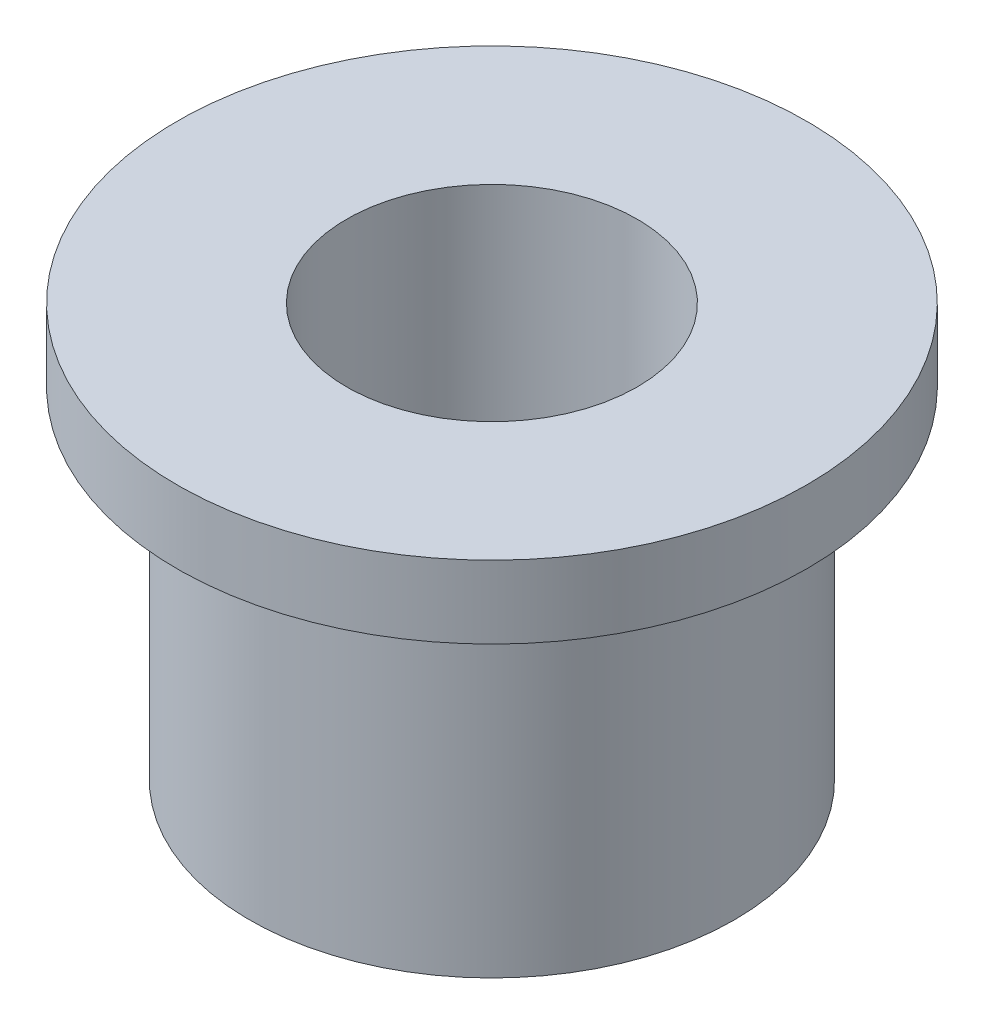
ISO-10303-21;
HEADER;
FILE_DESCRIPTION(('STEP AP214'),'2;1');
FILE_NAME('part.step','',(''),(''),'','','');
FILE_SCHEMA(('AUTOMOTIVE_DESIGN { 1 0 10303 214 1 1 1 1 }'));
ENDSEC;
DATA;
#1=APPLICATION_CONTEXT('core data for automotive mechanical design processes');
#2=APPLICATION_PROTOCOL_DEFINITION('international standard','automotive_design',2000,#1);
#3=PRODUCT_CONTEXT('',#1,'mechanical');
#4=PRODUCT('Part','Part','',(#3));
#5=PRODUCT_RELATED_PRODUCT_CATEGORY('part','',(#4));
#6=PRODUCT_DEFINITION_FORMATION('','',#4);
#7=PRODUCT_DEFINITION_CONTEXT('part definition',#1,'design');
#8=PRODUCT_DEFINITION('design','',#6,#7);
#9=PRODUCT_DEFINITION_SHAPE('','',#8);
#10=(LENGTH_UNIT() NAMED_UNIT(*) SI_UNIT(.MILLI.,.METRE.));
#11=(NAMED_UNIT(*) PLANE_ANGLE_UNIT() SI_UNIT($,.RADIAN.));
#12=(NAMED_UNIT(*) SI_UNIT($,.STERADIAN.) SOLID_ANGLE_UNIT());
#13=UNCERTAINTY_MEASURE_WITH_UNIT(LENGTH_MEASURE(1.E-05),#10,'distance_accuracy_value','');
#14=(GEOMETRIC_REPRESENTATION_CONTEXT(3) GLOBAL_UNCERTAINTY_ASSIGNED_CONTEXT((#13)) GLOBAL_UNIT_ASSIGNED_CONTEXT((#10,
#11,#12)) REPRESENTATION_CONTEXT('',''));
#15=CARTESIAN_POINT('',(0.,0.,0.));
#16=DIRECTION('',(0.,0.,1.));
#17=DIRECTION('',(1.,0.,0.));
#18=AXIS2_PLACEMENT_3D('',#15,#16,#17);
#19=CARTESIAN_POINT('',(0.,8.52868852458955,0.));
#20=DIRECTION('',(0.,-1.,0.));
#21=DIRECTION('',(1.00000000000001,0.,0.));
#22=AXIS2_PLACEMENT_3D('',#19,#20,#21);
#23=PLANE('',#22);
#24=CARTESIAN_POINT('',(0.,8.52868852458954,0.));
#25=DIRECTION('',(0.,-1.,0.));
#26=DIRECTION('',(1.00000000000001,0.,0.));
#27=AXIS2_PLACEMENT_3D('',#24,#25,#26);
#28=CIRCLE('',#27,6.50000000000059);
#29=CARTESIAN_POINT('',(6.50000000000061,8.52868852458957,0.));
#30=VERTEX_POINT('',#29);
#31=EDGE_CURVE('E52',#30,#30,#28,.T.);
#32=ORIENTED_EDGE('',*,*,#31,.F.);
#33=EDGE_LOOP('',(#32));
#34=FACE_BOUND('',#33,.T.);
#35=CARTESIAN_POINT('',(0.,8.52868852458957,0.));
#36=DIRECTION('',(0.,-1.,0.));
#37=DIRECTION('',(1.00000000000001,0.,0.));
#38=AXIS2_PLACEMENT_3D('',#35,#36,#37);
#39=CIRCLE('',#38,3.00000000000003);
#40=CARTESIAN_POINT('',(3.00000000000002,8.52868852458958,0.));
#41=VERTEX_POINT('',#40);
#42=EDGE_CURVE('E10',#41,#41,#39,.T.);
#43=ORIENTED_EDGE('',*,*,#42,.T.);
#44=EDGE_LOOP('',(#43));
#45=FACE_BOUND('',#44,.T.);
#46=ADVANCED_FACE('F30',(#34,#45),#23,.F.);
#47=CARTESIAN_POINT('',(5.8848621387273E-13,-171.557870598865,0.));
#48=DIRECTION('',(0.,-1.,0.));
#49=DIRECTION('',(1.00000000000001,0.,0.));
#50=AXIS2_PLACEMENT_3D('',#47,#48,#49);
#51=CYLINDRICAL_SURFACE('',#50,3.00000000000001);
#52=CARTESIAN_POINT('',(0.,0.,0.));
#53=DIRECTION('',(0.,-1.,0.));
#54=DIRECTION('',(1.00000000000001,0.,0.));
#55=AXIS2_PLACEMENT_3D('',#52,#53,#54);
#56=CIRCLE('',#55,3.);
#57=CARTESIAN_POINT('',(3.00000000000002,0.,0.));
#58=VERTEX_POINT('',#57);
#59=EDGE_CURVE('E36',#58,#58,#56,.T.);
#60=ORIENTED_EDGE('',*,*,#59,.T.);
#61=EDGE_LOOP('',(#60));
#62=FACE_BOUND('',#61,.T.);
#63=ORIENTED_EDGE('',*,*,#42,.F.);
#64=EDGE_LOOP('',(#63));
#65=FACE_BOUND('',#64,.T.);
#66=ADVANCED_FACE('F59',(#62,#65),#51,.F.);
#67=CARTESIAN_POINT('',(0.,0.,0.));
#68=DIRECTION('',(0.,1.,0.));
#69=DIRECTION('',(-1.00000000000001,0.,0.));
#70=AXIS2_PLACEMENT_3D('',#67,#68,#69);
#71=PLANE('',#70);
#72=ORIENTED_EDGE('',*,*,#59,.F.);
#73=EDGE_LOOP('',(#72));
#74=FACE_BOUND('',#73,.T.);
#75=CARTESIAN_POINT('',(0.,0.,0.));
#76=DIRECTION('',(0.,-1.,0.));
#77=DIRECTION('',(1.00000000000001,0.,0.));
#78=AXIS2_PLACEMENT_3D('',#75,#76,#77);
#79=CIRCLE('',#78,5.);
#80=CARTESIAN_POINT('',(5.00000000000004,0.,0.));
#81=VERTEX_POINT('',#80);
#82=EDGE_CURVE('E40',#81,#81,#79,.T.);
#83=ORIENTED_EDGE('',*,*,#82,.T.);
#84=EDGE_LOOP('',(#83));
#85=FACE_BOUND('',#84,.T.);
#86=ADVANCED_FACE('F63',(#74,#85),#71,.F.);
#87=CARTESIAN_POINT('',(5.8848621387273E-13,-171.557870598865,0.));
#88=DIRECTION('',(0.,-1.,0.));
#89=DIRECTION('',(1.00000000000001,0.,0.));
#90=AXIS2_PLACEMENT_3D('',#87,#88,#89);
#91=CYLINDRICAL_SURFACE('',#90,5.00000000000001);
#92=ORIENTED_EDGE('',*,*,#82,.F.);
#93=EDGE_LOOP('',(#92));
#94=FACE_BOUND('',#93,.T.);
#95=CARTESIAN_POINT('',(0.,7.02868852458954,0.));
#96=DIRECTION('',(0.,-1.,0.));
#97=DIRECTION('',(1.00000000000001,0.,0.));
#98=AXIS2_PLACEMENT_3D('',#95,#96,#97);
#99=CIRCLE('',#98,5.00000000000002);
#100=CARTESIAN_POINT('',(5.00000000000004,7.02868852458956,0.));
#101=VERTEX_POINT('',#100);
#102=EDGE_CURVE('E44',#101,#101,#99,.T.);
#103=ORIENTED_EDGE('',*,*,#102,.T.);
#104=EDGE_LOOP('',(#103));
#105=FACE_BOUND('',#104,.T.);
#106=ADVANCED_FACE('F67',(#94,#105),#91,.T.);
#107=CARTESIAN_POINT('',(0.,7.02868852458955,0.));
#108=DIRECTION('',(0.,-1.,0.));
#109=DIRECTION('',(1.00000000000001,0.,0.));
#110=AXIS2_PLACEMENT_3D('',#107,#108,#109);
#111=PLANE('',#110);
#112=CARTESIAN_POINT('',(0.,7.02868852458954,0.));
#113=DIRECTION('',(0.,-1.,0.));
#114=DIRECTION('',(1.00000000000001,0.,0.));
#115=AXIS2_PLACEMENT_3D('',#112,#113,#114);
#116=CIRCLE('',#115,6.50000000000058);
#117=CARTESIAN_POINT('',(6.50000000000061,7.02868852458957,0.));
#118=VERTEX_POINT('',#117);
#119=EDGE_CURVE('E49',#118,#118,#116,.T.);
#120=ORIENTED_EDGE('',*,*,#119,.T.);
#121=EDGE_LOOP('',(#120));
#122=FACE_BOUND('',#121,.T.);
#123=ORIENTED_EDGE('',*,*,#102,.F.);
#124=EDGE_LOOP('',(#123));
#125=FACE_BOUND('',#124,.T.);
#126=ADVANCED_FACE('F74',(#122,#125),#111,.T.);
#127=CARTESIAN_POINT('',(5.8848621387273E-13,-171.557870598865,0.));
#128=DIRECTION('',(0.,-1.,0.));
#129=DIRECTION('',(1.00000000000001,0.,0.));
#130=AXIS2_PLACEMENT_3D('',#127,#128,#129);
#131=CYLINDRICAL_SURFACE('',#130,6.50000000000059);
#132=ORIENTED_EDGE('',*,*,#119,.F.);
#133=EDGE_LOOP('',(#132));
#134=FACE_BOUND('',#133,.T.);
#135=ORIENTED_EDGE('',*,*,#31,.T.);
#136=EDGE_LOOP('',(#135));
#137=FACE_BOUND('',#136,.T.);
#138=ADVANCED_FACE('F56',(#134,#137),#131,.T.);
#139=CLOSED_SHELL('',(#46,#66,#86,#106,#126,#138));
#140=MANIFOLD_SOLID_BREP('B2',#139);
#141=ADVANCED_BREP_SHAPE_REPRESENTATION('',(#18,#140),#14);
#142=SHAPE_DEFINITION_REPRESENTATION(#9,#141);
ENDSEC;
END-ISO-10303-21;
